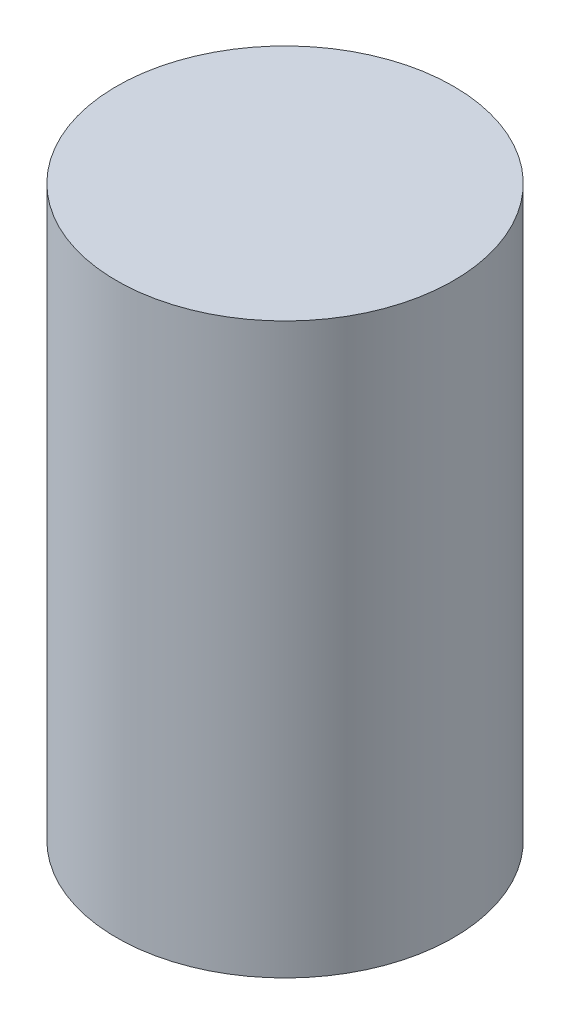
ISO-10303-21;
HEADER;
FILE_DESCRIPTION(('STEP AP214'),'2;1');
FILE_NAME('part.step','',(''),(''),'','','');
FILE_SCHEMA(('AUTOMOTIVE_DESIGN { 1 0 10303 214 1 1 1 1 }'));
ENDSEC;
DATA;
#1=APPLICATION_CONTEXT('core data for automotive mechanical design processes');
#2=APPLICATION_PROTOCOL_DEFINITION('international standard','automotive_design',2000,#1);
#3=PRODUCT_CONTEXT('',#1,'mechanical');
#4=PRODUCT('Part','Part','',(#3));
#5=PRODUCT_RELATED_PRODUCT_CATEGORY('part','',(#4));
#6=PRODUCT_DEFINITION_FORMATION('','',#4);
#7=PRODUCT_DEFINITION_CONTEXT('part definition',#1,'design');
#8=PRODUCT_DEFINITION('design','',#6,#7);
#9=PRODUCT_DEFINITION_SHAPE('','',#8);
#10=(LENGTH_UNIT() NAMED_UNIT(*) SI_UNIT(.MILLI.,.METRE.));
#11=(NAMED_UNIT(*) PLANE_ANGLE_UNIT() SI_UNIT($,.RADIAN.));
#12=(NAMED_UNIT(*) SI_UNIT($,.STERADIAN.) SOLID_ANGLE_UNIT());
#13=UNCERTAINTY_MEASURE_WITH_UNIT(LENGTH_MEASURE(1.E-05),#10,'distance_accuracy_value','');
#14=(GEOMETRIC_REPRESENTATION_CONTEXT(3) GLOBAL_UNCERTAINTY_ASSIGNED_CONTEXT((#13)) GLOBAL_UNIT_ASSIGNED_CONTEXT((#10,
#11,#12)) REPRESENTATION_CONTEXT('',''));
#15=CARTESIAN_POINT('',(0.,0.,0.));
#16=DIRECTION('',(0.,0.,1.));
#17=DIRECTION('',(1.,0.,0.));
#18=AXIS2_PLACEMENT_3D('',#15,#16,#17);
#19=CARTESIAN_POINT('',(0.,7.6,0.));
#20=DIRECTION('',(0.,-1.,0.));
#21=DIRECTION('',(0.,0.,-1.));
#22=AXIS2_PLACEMENT_3D('',#19,#20,#21);
#23=CYLINDRICAL_SURFACE('',#22,2.25);
#24=CARTESIAN_POINT('',(0.,7.6,0.));
#25=DIRECTION('',(0.,1.,0.));
#26=DIRECTION('',(0.,0.,1.));
#27=AXIS2_PLACEMENT_3D('',#24,#25,#26);
#28=CIRCLE('',#27,2.25);
#29=CARTESIAN_POINT('',(0.,7.6,-2.25));
#30=VERTEX_POINT('',#29);
#31=EDGE_CURVE('E10',#30,#30,#28,.T.);
#32=CARTESIAN_POINT('',(0.,0.,0.));
#33=DIRECTION('',(0.,1.,0.));
#34=DIRECTION('',(0.,0.,1.));
#35=AXIS2_PLACEMENT_3D('',#32,#33,#34);
#36=CIRCLE('',#35,2.25);
#37=CARTESIAN_POINT('',(0.,0.,-2.25));
#38=VERTEX_POINT('',#37);
#39=EDGE_CURVE('E34',#38,#38,#36,.T.);
#40=CARTESIAN_POINT('',(0.,7.6,-2.25));
#41=CARTESIAN_POINT('',(0.,7.52083333333333,-2.25));
#42=CARTESIAN_POINT('',(0.,7.44166666666667,-2.25));
#43=CARTESIAN_POINT('',(0.,7.28333333333333,-2.25));
#44=CARTESIAN_POINT('',(0.,7.20416666666667,-2.25));
#45=CARTESIAN_POINT('',(0.,7.04583333333333,-2.25));
#46=CARTESIAN_POINT('',(0.,6.96666666666667,-2.25));
#47=CARTESIAN_POINT('',(0.,6.80833333333333,-2.25));
#48=CARTESIAN_POINT('',(0.,6.72916666666667,-2.25));
#49=CARTESIAN_POINT('',(0.,6.57083333333333,-2.25));
#50=CARTESIAN_POINT('',(0.,6.49166666666667,-2.25));
#51=CARTESIAN_POINT('',(0.,6.33333333333333,-2.25));
#52=CARTESIAN_POINT('',(0.,6.25416666666667,-2.25));
#53=CARTESIAN_POINT('',(0.,6.09583333333333,-2.25));
#54=CARTESIAN_POINT('',(0.,6.01666666666667,-2.25));
#55=CARTESIAN_POINT('',(0.,5.85833333333333,-2.25));
#56=CARTESIAN_POINT('',(0.,5.77916666666667,-2.25));
#57=CARTESIAN_POINT('',(0.,5.62083333333333,-2.25));
#58=CARTESIAN_POINT('',(0.,5.54166666666667,-2.25));
#59=CARTESIAN_POINT('',(0.,5.38333333333333,-2.25));
#60=CARTESIAN_POINT('',(0.,5.30416666666667,-2.25));
#61=CARTESIAN_POINT('',(0.,5.14583333333333,-2.25));
#62=CARTESIAN_POINT('',(0.,5.06666666666667,-2.25));
#63=CARTESIAN_POINT('',(0.,4.90833333333333,-2.25));
#64=CARTESIAN_POINT('',(0.,4.82916666666667,-2.25));
#65=CARTESIAN_POINT('',(0.,4.67083333333333,-2.25));
#66=CARTESIAN_POINT('',(0.,4.59166666666667,-2.25));
#67=CARTESIAN_POINT('',(0.,4.43333333333333,-2.25));
#68=CARTESIAN_POINT('',(0.,4.35416666666667,-2.25));
#69=CARTESIAN_POINT('',(0.,4.19583333333333,-2.25));
#70=CARTESIAN_POINT('',(0.,4.11666666666667,-2.25));
#71=CARTESIAN_POINT('',(0.,3.95833333333333,-2.25));
#72=CARTESIAN_POINT('',(0.,3.87916666666667,-2.25));
#73=CARTESIAN_POINT('',(0.,3.72083333333333,-2.25));
#74=CARTESIAN_POINT('',(0.,3.64166666666667,-2.25));
#75=CARTESIAN_POINT('',(0.,3.48333333333333,-2.25));
#76=CARTESIAN_POINT('',(0.,3.40416666666667,-2.25));
#77=CARTESIAN_POINT('',(0.,3.24583333333333,-2.25));
#78=CARTESIAN_POINT('',(0.,3.16666666666667,-2.25));
#79=CARTESIAN_POINT('',(0.,3.00833333333333,-2.25));
#80=CARTESIAN_POINT('',(0.,2.92916666666667,-2.25));
#81=CARTESIAN_POINT('',(0.,2.77083333333333,-2.25));
#82=CARTESIAN_POINT('',(0.,2.69166666666667,-2.25));
#83=CARTESIAN_POINT('',(0.,2.53333333333333,-2.25));
#84=CARTESIAN_POINT('',(0.,2.45416666666667,-2.25));
#85=CARTESIAN_POINT('',(0.,2.29583333333333,-2.25));
#86=CARTESIAN_POINT('',(0.,2.21666666666667,-2.25));
#87=CARTESIAN_POINT('',(0.,2.05833333333333,-2.25));
#88=CARTESIAN_POINT('',(0.,1.97916666666667,-2.25));
#89=CARTESIAN_POINT('',(0.,1.82083333333333,-2.25));
#90=CARTESIAN_POINT('',(0.,1.74166666666667,-2.25));
#91=CARTESIAN_POINT('',(0.,1.58333333333333,-2.25));
#92=CARTESIAN_POINT('',(0.,1.50416666666667,-2.25));
#93=CARTESIAN_POINT('',(0.,1.34583333333333,-2.25));
#94=CARTESIAN_POINT('',(0.,1.26666666666667,-2.25));
#95=CARTESIAN_POINT('',(0.,1.10833333333333,-2.25));
#96=CARTESIAN_POINT('',(0.,1.02916666666667,-2.25));
#97=CARTESIAN_POINT('',(0.,0.870833333333334,-2.25));
#98=CARTESIAN_POINT('',(0.,0.791666666666667,-2.25));
#99=CARTESIAN_POINT('',(0.,0.633333333333334,-2.25));
#100=CARTESIAN_POINT('',(0.,0.554166666666667,-2.25));
#101=CARTESIAN_POINT('',(0.,0.395833333333333,-2.25));
#102=CARTESIAN_POINT('',(0.,0.316666666666666,-2.25));
#103=CARTESIAN_POINT('',(0.,0.158333333333333,-2.25));
#104=CARTESIAN_POINT('',(0.,0.0791666666666666,-2.25));
#105=CARTESIAN_POINT('',(0.,0.,-2.25));
#106=B_SPLINE_CURVE_WITH_KNOTS('',3,(#40,#41,#42,#43,#44,#45,#46,#47,#48,#49,#50,#51,#52,#53,
#54,#55,#56,#57,#58,#59,#60,#61,#62,#63,#64,#65,#66,#67,#68,#69,#70,#71,#72,#73,#74,#75,#76,#77,
#78,#79,#80,#81,#82,#83,#84,#85,#86,#87,#88,#89,#90,#91,#92,#93,#94,#95,#96,#97,#98,#99,#100,
#101,#102,#103,#104,#105),.UNSPECIFIED.,.F.,.F.,(4,2,2,2,2,2,2,2,2,2,2,2,2,2,2,2,2,2,2,2,2,2,2,
2,2,2,2,2,2,2,2,2,4),(0.,0.237500000000001,0.475000000000001,0.7125,0.95,1.1875,1.425,1.6625,
1.9,2.1375,2.375,2.6125,2.85,3.0875,3.325,3.5625,3.8,4.0375,4.275,4.5125,4.75,4.9875,5.225,
5.4625,5.7,5.9375,6.175,6.4125,6.65,6.8875,7.125,7.3625,7.6),.UNSPECIFIED.);
#107=EDGE_CURVE('BSEAM31',#30,#38,#106,.T.);
#108=ORIENTED_EDGE('',*,*,#31,.F.);
#109=ORIENTED_EDGE('',*,*,#39,.T.);
#110=ORIENTED_EDGE('',*,*,#107,.T.);
#111=ORIENTED_EDGE('',*,*,#107,.F.);
#112=EDGE_LOOP('',(#108,#110,#109,#111));
#113=FACE_BOUND('',#112,.T.);
#114=ADVANCED_FACE('F31',(#113),#23,.T.);
#115=CARTESIAN_POINT('',(0.,7.6,0.));
#116=DIRECTION('',(0.,1.,0.));
#117=DIRECTION('',(0.,0.,1.));
#118=AXIS2_PLACEMENT_3D('',#115,#116,#117);
#119=PLANE('',#118);
#120=ORIENTED_EDGE('',*,*,#31,.T.);
#121=EDGE_LOOP('',(#120));
#122=FACE_BOUND('',#121,.T.);
#123=ADVANCED_FACE('F46',(#122),#119,.T.);
#124=CARTESIAN_POINT('',(0.,0.,0.));
#125=DIRECTION('',(0.,1.,0.));
#126=DIRECTION('',(0.,0.,1.));
#127=AXIS2_PLACEMENT_3D('',#124,#125,#126);
#128=PLANE('',#127);
#129=ORIENTED_EDGE('',*,*,#39,.F.);
#130=EDGE_LOOP('',(#129));
#131=FACE_BOUND('',#130,.T.);
#132=ADVANCED_FACE('F44',(#131),#128,.F.);
#133=CLOSED_SHELL('',(#114,#123,#132));
#134=MANIFOLD_SOLID_BREP('B2',#133);
#135=ADVANCED_BREP_SHAPE_REPRESENTATION('',(#18,#134),#14);
#136=SHAPE_DEFINITION_REPRESENTATION(#9,#135);
ENDSEC;
END-ISO-10303-21;
